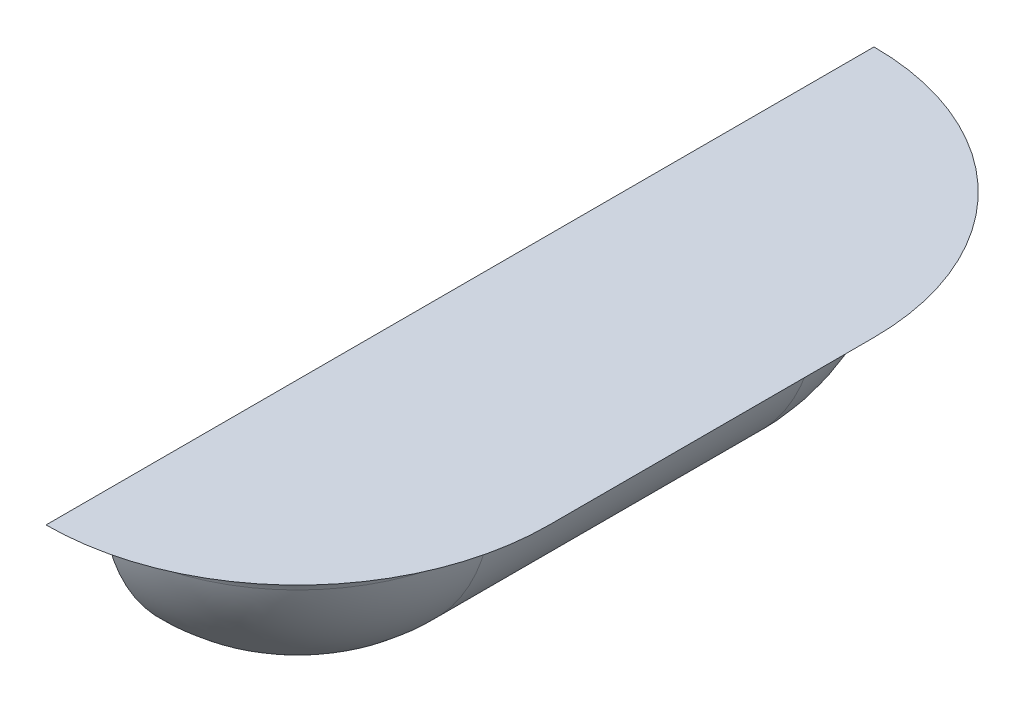
ISO-10303-21;
HEADER;
FILE_DESCRIPTION(('STEP AP214'),'2;1');
FILE_NAME('part.step','',(''),(''),'','','');
FILE_SCHEMA(('AUTOMOTIVE_DESIGN { 1 0 10303 214 1 1 1 1 }'));
ENDSEC;
DATA;
#1=APPLICATION_CONTEXT('core data for automotive mechanical design processes');
#2=APPLICATION_PROTOCOL_DEFINITION('international standard','automotive_design',2000,#1);
#3=PRODUCT_CONTEXT('',#1,'mechanical');
#4=PRODUCT('Part','Part','',(#3));
#5=PRODUCT_RELATED_PRODUCT_CATEGORY('part','',(#4));
#6=PRODUCT_DEFINITION_FORMATION('','',#4);
#7=PRODUCT_DEFINITION_CONTEXT('part definition',#1,'design');
#8=PRODUCT_DEFINITION('design','',#6,#7);
#9=PRODUCT_DEFINITION_SHAPE('','',#8);
#10=(LENGTH_UNIT() NAMED_UNIT(*) SI_UNIT(.MILLI.,.METRE.));
#11=(NAMED_UNIT(*) PLANE_ANGLE_UNIT() SI_UNIT($,.RADIAN.));
#12=(NAMED_UNIT(*) SI_UNIT($,.STERADIAN.) SOLID_ANGLE_UNIT());
#13=UNCERTAINTY_MEASURE_WITH_UNIT(LENGTH_MEASURE(1.E-05),#10,'distance_accuracy_value','');
#14=(GEOMETRIC_REPRESENTATION_CONTEXT(3) GLOBAL_UNCERTAINTY_ASSIGNED_CONTEXT((#13)) GLOBAL_UNIT_ASSIGNED_CONTEXT((#10,
#11,#12)) REPRESENTATION_CONTEXT('',''));
#15=CARTESIAN_POINT('',(0.,0.,0.));
#16=DIRECTION('',(0.,0.,1.));
#17=DIRECTION('',(1.,0.,0.));
#18=AXIS2_PLACEMENT_3D('',#15,#16,#17);
#19=CARTESIAN_POINT('',(-3.,0.,5.));
#20=DIRECTION('',(1.,0.,0.));
#21=DIRECTION('',(0.,0.,-1.));
#22=AXIS2_PLACEMENT_3D('',#19,#20,#21);
#23=PLANE('',#22);
#24=DIRECTION('',(0.,0.,-1.));
#25=VECTOR('',#24,1.);
#26=CARTESIAN_POINT('',(-3.,0.,5.));
#27=LINE('',#26,#25);
#28=CARTESIAN_POINT('',(-3.,0.,12.7459666924148));
#29=VERTEX_POINT('',#28);
#30=CARTESIAN_POINT('',(-3.,0.,-12.7459666924148));
#31=VERTEX_POINT('',#30);
#32=EDGE_CURVE('E96',#29,#31,#27,.T.);
#33=ORIENTED_EDGE('',*,*,#32,.T.);
#34=CARTESIAN_POINT('',(-3.,-2.,-12.7459666924148));
#35=DIRECTION('',(1.,0.,0.));
#36=DIRECTION('',(0.,0.,-1.));
#37=AXIS2_PLACEMENT_3D('',#34,#35,#36);
#38=CIRCLE('',#37,2.);
#39=CARTESIAN_POINT('',(-3.00000000000002,-1.5,-10.8094750193111));
#40=VERTEX_POINT('',#39);
#41=EDGE_CURVE('E11',#31,#40,#38,.T.);
#42=ORIENTED_EDGE('',*,*,#41,.T.);
#43=CARTESIAN_POINT('',(-3.,0.,-5.));
#44=DIRECTION('',(-1.,0.,0.));
#45=DIRECTION('',(0.,0.,1.));
#46=AXIS2_PLACEMENT_3D('',#43,#44,#45);
#47=CIRCLE('',#46,6.);
#48=CARTESIAN_POINT('',(-3.,-6.,-5.));
#49=VERTEX_POINT('',#48);
#50=EDGE_CURVE('E129',#40,#49,#47,.T.);
#51=ORIENTED_EDGE('',*,*,#50,.T.);
#52=DIRECTION('',(0.,0.,-1.));
#53=VECTOR('',#52,1.);
#54=CARTESIAN_POINT('',(-3.,-6.,5.));
#55=LINE('',#54,#53);
#56=CARTESIAN_POINT('',(-3.,-6.,5.));
#57=VERTEX_POINT('',#56);
#58=EDGE_CURVE('E125',#57,#49,#55,.T.);
#59=ORIENTED_EDGE('',*,*,#58,.F.);
#60=CARTESIAN_POINT('',(-3.,0.,5.));
#61=DIRECTION('',(-1.,0.,0.));
#62=DIRECTION('',(0.,0.,1.));
#63=AXIS2_PLACEMENT_3D('',#60,#61,#62);
#64=CIRCLE('',#63,6.);
#65=CARTESIAN_POINT('',(-3.00000000000002,-1.5,10.8094750193111));
#66=VERTEX_POINT('',#65);
#67=EDGE_CURVE('E123',#57,#66,#64,.T.);
#68=ORIENTED_EDGE('',*,*,#67,.T.);
#69=CARTESIAN_POINT('',(-3.,-2.,12.7459666924148));
#70=DIRECTION('',(1.,0.,0.));
#71=DIRECTION('',(0.,0.,-1.));
#72=AXIS2_PLACEMENT_3D('',#69,#70,#71);
#73=CIRCLE('',#72,2.);
#74=EDGE_CURVE('E51',#66,#29,#73,.T.);
#75=ORIENTED_EDGE('',*,*,#74,.T.);
#76=EDGE_LOOP('',(#33,#42,#51,#59,#68,#75));
#77=FACE_BOUND('',#76,.T.);
#78=ADVANCED_FACE('F42',(#77),#23,.F.);
#79=CARTESIAN_POINT('',(-3.,0.,5.));
#80=DIRECTION('',(0.,0.,-1.));
#81=DIRECTION('',(-1.,0.,0.));
#82=AXIS2_PLACEMENT_3D('',#79,#80,#81);
#83=CYLINDRICAL_SURFACE('',#82,6.);
#84=CARTESIAN_POINT('',(-3.,0.,-5.));
#85=DIRECTION('',(0.,0.,1.));
#86=DIRECTION('',(1.,0.,0.));
#87=AXIS2_PLACEMENT_3D('',#84,#85,#86);
#88=CIRCLE('',#87,6.);
#89=CARTESIAN_POINT('',(2.80947501931112,-1.5,-5.));
#90=VERTEX_POINT('',#89);
#91=EDGE_CURVE('E128',#49,#90,#88,.T.);
#92=ORIENTED_EDGE('',*,*,#91,.T.);
#93=DIRECTION('',(0.,0.,-1.));
#94=VECTOR('',#93,1.);
#95=CARTESIAN_POINT('',(2.80947501931112,-1.5,5.));
#96=LINE('',#95,#94);
#97=CARTESIAN_POINT('',(2.80947501931112,-1.5,5.));
#98=VERTEX_POINT('',#97);
#99=EDGE_CURVE('E117',#90,#98,#96,.F.);
#100=ORIENTED_EDGE('',*,*,#99,.T.);
#101=CARTESIAN_POINT('',(-3.,0.,5.));
#102=DIRECTION('',(0.,0.,1.));
#103=DIRECTION('',(1.,0.,0.));
#104=AXIS2_PLACEMENT_3D('',#101,#102,#103);
#105=CIRCLE('',#104,6.);
#106=EDGE_CURVE('E131',#57,#98,#105,.T.);
#107=ORIENTED_EDGE('',*,*,#106,.F.);
#108=ORIENTED_EDGE('',*,*,#58,.T.);
#109=EDGE_LOOP('',(#92,#100,#107,#108));
#110=FACE_BOUND('',#109,.T.);
#111=ADVANCED_FACE('F137',(#110),#83,.T.);
#112=CARTESIAN_POINT('',(-3.,0.,5.));
#113=DIRECTION('',(0.,1.,0.));
#114=DIRECTION('',(0.,0.,-1.));
#115=AXIS2_PLACEMENT_3D('',#112,#113,#114);
#116=SPHERICAL_SURFACE('',#115,6.);
#117=ORIENTED_EDGE('',*,*,#106,.T.);
#118=CARTESIAN_POINT('',(-3.,-1.5,5.));
#119=DIRECTION('',(0.,1.,0.));
#120=DIRECTION('',(0.,0.,1.));
#121=AXIS2_PLACEMENT_3D('',#118,#119,#120);
#122=CIRCLE('',#121,5.80947501931112);
#123=EDGE_CURVE('E100',#98,#66,#122,.F.);
#124=ORIENTED_EDGE('',*,*,#123,.T.);
#125=ORIENTED_EDGE('',*,*,#67,.F.);
#126=EDGE_LOOP('',(#117,#124,#125));
#127=FACE_BOUND('',#126,.T.);
#128=ADVANCED_FACE('F138',(#127),#116,.T.);
#129=CARTESIAN_POINT('',(-3.,0.,-5.));
#130=DIRECTION('',(0.,-1.,0.));
#131=DIRECTION('',(0.,0.,-1.));
#132=AXIS2_PLACEMENT_3D('',#129,#130,#131);
#133=SPHERICAL_SURFACE('',#132,6.);
#134=ORIENTED_EDGE('',*,*,#50,.F.);
#135=CARTESIAN_POINT('',(-3.,-1.5,-5.));
#136=DIRECTION('',(0.,1.,0.));
#137=DIRECTION('',(0.,0.,1.));
#138=AXIS2_PLACEMENT_3D('',#135,#136,#137);
#139=CIRCLE('',#138,5.80947501931112);
#140=EDGE_CURVE('E64',#40,#90,#139,.F.);
#141=ORIENTED_EDGE('',*,*,#140,.T.);
#142=ORIENTED_EDGE('',*,*,#91,.F.);
#143=EDGE_LOOP('',(#134,#141,#142));
#144=FACE_BOUND('',#143,.T.);
#145=ADVANCED_FACE('F140',(#144),#133,.T.);
#146=CARTESIAN_POINT('',(-3.,-2.,-5.));
#147=DIRECTION('',(0.,1.,0.));
#148=DIRECTION('',(0.,0.,1.));
#149=AXIS2_PLACEMENT_3D('',#146,#147,#148);
#150=TOROIDAL_SURFACE('',#149,7.74596669241483,2.);
#151=ORIENTED_EDGE('',*,*,#41,.F.);
#152=CARTESIAN_POINT('',(-3.,0.,-5.));
#153=DIRECTION('',(0.,1.,0.));
#154=DIRECTION('',(0.,0.,1.));
#155=AXIS2_PLACEMENT_3D('',#152,#153,#154);
#156=CIRCLE('',#155,7.74596669241483);
#157=CARTESIAN_POINT('',(4.74596669241483,0.,-5.));
#158=VERTEX_POINT('',#157);
#159=EDGE_CURVE('E111',#158,#31,#156,.T.);
#160=ORIENTED_EDGE('',*,*,#159,.F.);
#161=CARTESIAN_POINT('',(4.74596669241483,-2.,-5.));
#162=DIRECTION('',(0.,0.,-1.));
#163=DIRECTION('',(-1.,0.,0.));
#164=AXIS2_PLACEMENT_3D('',#161,#162,#163);
#165=CIRCLE('',#164,2.);
#166=EDGE_CURVE('E46',#90,#158,#165,.T.);
#167=ORIENTED_EDGE('',*,*,#166,.F.);
#168=ORIENTED_EDGE('',*,*,#140,.F.);
#169=EDGE_LOOP('',(#151,#160,#167,#168));
#170=FACE_BOUND('',#169,.T.);
#171=ADVANCED_FACE('F44',(#170),#150,.F.);
#172=CARTESIAN_POINT('',(4.74596669241483,-2.,5.));
#173=DIRECTION('',(0.,0.,-1.));
#174=DIRECTION('',(-1.,0.,0.));
#175=AXIS2_PLACEMENT_3D('',#172,#173,#174);
#176=CYLINDRICAL_SURFACE('',#175,2.);
#177=ORIENTED_EDGE('',*,*,#166,.T.);
#178=DIRECTION('',(0.,0.,1.));
#179=VECTOR('',#178,1.);
#180=CARTESIAN_POINT('',(4.74596669241483,0.,-5.));
#181=LINE('',#180,#179);
#182=CARTESIAN_POINT('',(4.74596669241483,0.,5.));
#183=VERTEX_POINT('',#182);
#184=EDGE_CURVE('E94',#183,#158,#181,.F.);
#185=ORIENTED_EDGE('',*,*,#184,.F.);
#186=CARTESIAN_POINT('',(4.74596669241483,-2.,5.));
#187=DIRECTION('',(0.,0.,-1.));
#188=DIRECTION('',(-1.,0.,0.));
#189=AXIS2_PLACEMENT_3D('',#186,#187,#188);
#190=CIRCLE('',#189,2.);
#191=EDGE_CURVE('E104',#98,#183,#190,.T.);
#192=ORIENTED_EDGE('',*,*,#191,.F.);
#193=ORIENTED_EDGE('',*,*,#99,.F.);
#194=EDGE_LOOP('',(#177,#185,#192,#193));
#195=FACE_BOUND('',#194,.T.);
#196=ADVANCED_FACE('F109',(#195),#176,.F.);
#197=CARTESIAN_POINT('',(-3.,-2.,5.));
#198=DIRECTION('',(0.,1.,0.));
#199=DIRECTION('',(0.,0.,1.));
#200=AXIS2_PLACEMENT_3D('',#197,#198,#199);
#201=TOROIDAL_SURFACE('',#200,7.74596669241483,2.);
#202=ORIENTED_EDGE('',*,*,#74,.F.);
#203=ORIENTED_EDGE('',*,*,#123,.F.);
#204=ORIENTED_EDGE('',*,*,#191,.T.);
#205=CARTESIAN_POINT('',(-3.,0.,5.));
#206=DIRECTION('',(0.,1.,0.));
#207=DIRECTION('',(0.,0.,1.));
#208=AXIS2_PLACEMENT_3D('',#205,#206,#207);
#209=CIRCLE('',#208,7.74596669241483);
#210=EDGE_CURVE('E90',#29,#183,#209,.T.);
#211=ORIENTED_EDGE('',*,*,#210,.F.);
#212=EDGE_LOOP('',(#202,#203,#204,#211));
#213=FACE_BOUND('',#212,.T.);
#214=ADVANCED_FACE('F105',(#213),#201,.F.);
#215=CARTESIAN_POINT('',(15.,0.,-25.));
#216=DIRECTION('',(0.,-1.,0.));
#217=DIRECTION('',(0.,0.,-1.));
#218=AXIS2_PLACEMENT_3D('',#215,#216,#217);
#219=PLANE('',#218);
#220=ORIENTED_EDGE('',*,*,#210,.T.);
#221=ORIENTED_EDGE('',*,*,#184,.T.);
#222=ORIENTED_EDGE('',*,*,#159,.T.);
#223=ORIENTED_EDGE('',*,*,#32,.F.);
#224=EDGE_LOOP('',(#220,#221,#222,#223));
#225=FACE_BOUND('',#224,.T.);
#226=ADVANCED_FACE('F92',(#225),#219,.F.);
#227=CLOSED_SHELL('',(#78,#111,#128,#145,#171,#196,#214,#226));
#228=MANIFOLD_SOLID_BREP('B2',#227);
#229=ADVANCED_BREP_SHAPE_REPRESENTATION('',(#18,#228),#14);
#230=SHAPE_DEFINITION_REPRESENTATION(#9,#229);
ENDSEC;
END-ISO-10303-21;
